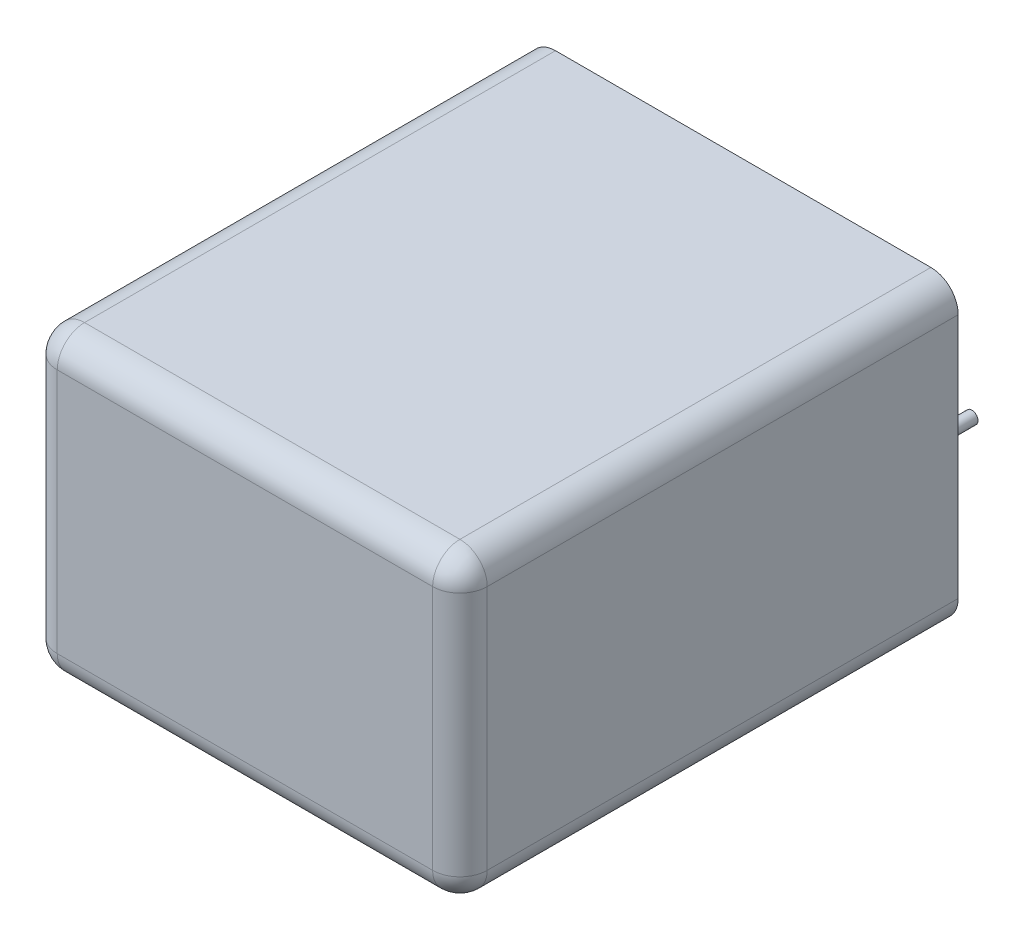
ISO-10303-21;
HEADER;
FILE_DESCRIPTION(('STEP AP214'),'2;1');
FILE_NAME('part.step','',(''),(''),'','','');
FILE_SCHEMA(('AUTOMOTIVE_DESIGN { 1 0 10303 214 1 1 1 1 }'));
ENDSEC;
DATA;
#1=APPLICATION_CONTEXT('core data for automotive mechanical design processes');
#2=APPLICATION_PROTOCOL_DEFINITION('international standard','automotive_design',2000,#1);
#3=PRODUCT_CONTEXT('',#1,'mechanical');
#4=PRODUCT('Part','Part','',(#3));
#5=PRODUCT_RELATED_PRODUCT_CATEGORY('part','',(#4));
#6=PRODUCT_DEFINITION_FORMATION('','',#4);
#7=PRODUCT_DEFINITION_CONTEXT('part definition',#1,'design');
#8=PRODUCT_DEFINITION('design','',#6,#7);
#9=PRODUCT_DEFINITION_SHAPE('','',#8);
#10=(LENGTH_UNIT() NAMED_UNIT(*) SI_UNIT(.MILLI.,.METRE.));
#11=(NAMED_UNIT(*) PLANE_ANGLE_UNIT() SI_UNIT($,.RADIAN.));
#12=(NAMED_UNIT(*) SI_UNIT($,.STERADIAN.) SOLID_ANGLE_UNIT());
#13=UNCERTAINTY_MEASURE_WITH_UNIT(LENGTH_MEASURE(1.E-05),#10,'distance_accuracy_value','');
#14=(GEOMETRIC_REPRESENTATION_CONTEXT(3) GLOBAL_UNCERTAINTY_ASSIGNED_CONTEXT((#13)) GLOBAL_UNIT_ASSIGNED_CONTEXT((#10,
#11,#12)) REPRESENTATION_CONTEXT('',''));
#15=CARTESIAN_POINT('',(0.,0.,0.));
#16=DIRECTION('',(0.,0.,1.));
#17=DIRECTION('',(1.,0.,0.));
#18=AXIS2_PLACEMENT_3D('',#15,#16,#17);
#19=CARTESIAN_POINT('',(0.,0.,-3.));
#20=DIRECTION('',(0.,0.,-1.));
#21=DIRECTION('',(-1.,0.,0.));
#22=AXIS2_PLACEMENT_3D('',#19,#20,#21);
#23=PLANE('',#22);
#24=CARTESIAN_POINT('',(0.,0.,-3.));
#25=DIRECTION('',(0.,0.,1.));
#26=DIRECTION('',(1.,0.,0.));
#27=AXIS2_PLACEMENT_3D('',#24,#25,#26);
#28=CIRCLE('',#27,0.45);
#29=CARTESIAN_POINT('',(0.45,0.,-3.));
#30=VERTEX_POINT('',#29);
#31=EDGE_CURVE('E20',#30,#30,#28,.T.);
#32=ORIENTED_EDGE('',*,*,#31,.F.);
#33=EDGE_LOOP('',(#32));
#34=FACE_BOUND('',#33,.T.);
#35=ADVANCED_FACE('F17',(#34),#23,.T.);
#36=CARTESIAN_POINT('',(27.5,0.,-3.));
#37=DIRECTION('',(0.,0.,-1.));
#38=DIRECTION('',(-1.,0.,0.));
#39=AXIS2_PLACEMENT_3D('',#36,#37,#38);
#40=PLANE('',#39);
#41=CARTESIAN_POINT('',(27.5,0.,-3.));
#42=DIRECTION('',(0.,0.,1.));
#43=DIRECTION('',(1.,0.,0.));
#44=AXIS2_PLACEMENT_3D('',#41,#42,#43);
#45=CIRCLE('',#44,0.45);
#46=CARTESIAN_POINT('',(27.95,0.,-3.));
#47=VERTEX_POINT('',#46);
#48=EDGE_CURVE('E246',#47,#47,#45,.T.);
#49=ORIENTED_EDGE('',*,*,#48,.F.);
#50=EDGE_LOOP('',(#49));
#51=FACE_BOUND('',#50,.T.);
#52=ADVANCED_FACE('F482',(#51),#40,.T.);
#53=CARTESIAN_POINT('',(0.,9.,34.5));
#54=DIRECTION('',(1.,0.,0.));
#55=DIRECTION('',(0.,0.,-1.));
#56=AXIS2_PLACEMENT_3D('',#53,#54,#55);
#57=SPHERICAL_SURFACE('',#56,2.);
#58=CARTESIAN_POINT('',(0.,9.,34.5));
#59=DIRECTION('',(1.,0.,0.));
#60=DIRECTION('',(0.,0.,-1.));
#61=AXIS2_PLACEMENT_3D('',#58,#59,#60);
#62=CIRCLE('',#61,2.);
#63=CARTESIAN_POINT('',(0.,11.,34.5));
#64=VERTEX_POINT('',#63);
#65=CARTESIAN_POINT('',(0.,8.99999999999693,36.5));
#66=VERTEX_POINT('',#65);
#67=EDGE_CURVE('E225',#64,#66,#62,.T.);
#68=ORIENTED_EDGE('',*,*,#67,.F.);
#69=CARTESIAN_POINT('',(0.,9.,34.5));
#70=DIRECTION('',(0.,0.,1.));
#71=DIRECTION('',(1.,0.,0.));
#72=AXIS2_PLACEMENT_3D('',#69,#70,#71);
#73=CIRCLE('',#72,2.);
#74=CARTESIAN_POINT('',(-2.,9.,34.5));
#75=VERTEX_POINT('',#74);
#76=EDGE_CURVE('E112',#75,#64,#73,.F.);
#77=ORIENTED_EDGE('',*,*,#76,.F.);
#78=CARTESIAN_POINT('',(0.,9.,34.5));
#79=DIRECTION('',(0.,1.,0.));
#80=DIRECTION('',(0.,0.,1.));
#81=AXIS2_PLACEMENT_3D('',#78,#79,#80);
#82=CIRCLE('',#81,2.);
#83=EDGE_CURVE('E227',#66,#75,#82,.F.);
#84=ORIENTED_EDGE('',*,*,#83,.F.);
#85=EDGE_LOOP('',(#68,#77,#84));
#86=FACE_BOUND('',#85,.T.);
#87=ADVANCED_FACE('F214',(#86),#57,.T.);
#88=CARTESIAN_POINT('',(27.5,9.,34.5));
#89=DIRECTION('',(1.,0.,0.));
#90=DIRECTION('',(0.,0.,-1.));
#91=AXIS2_PLACEMENT_3D('',#88,#89,#90);
#92=SPHERICAL_SURFACE('',#91,2.);
#93=CARTESIAN_POINT('',(27.5,9.,34.5));
#94=DIRECTION('',(0.,0.,-1.));
#95=DIRECTION('',(-1.,0.,0.));
#96=AXIS2_PLACEMENT_3D('',#93,#94,#95);
#97=CIRCLE('',#96,2.);
#98=CARTESIAN_POINT('',(27.5,11.,34.5));
#99=VERTEX_POINT('',#98);
#100=CARTESIAN_POINT('',(29.5,9.,34.5));
#101=VERTEX_POINT('',#100);
#102=EDGE_CURVE('E270',#99,#101,#97,.T.);
#103=ORIENTED_EDGE('',*,*,#102,.F.);
#104=CARTESIAN_POINT('',(27.5,9.,34.5));
#105=DIRECTION('',(1.,0.,0.));
#106=DIRECTION('',(0.,0.,-1.));
#107=AXIS2_PLACEMENT_3D('',#104,#105,#106);
#108=CIRCLE('',#107,2.);
#109=CARTESIAN_POINT('',(27.5,9.,36.5));
#110=VERTEX_POINT('',#109);
#111=EDGE_CURVE('E228',#110,#99,#108,.F.);
#112=ORIENTED_EDGE('',*,*,#111,.F.);
#113=CARTESIAN_POINT('',(27.5,9.,34.5));
#114=DIRECTION('',(0.,1.,0.));
#115=DIRECTION('',(0.,0.,1.));
#116=AXIS2_PLACEMENT_3D('',#113,#114,#115);
#117=CIRCLE('',#116,2.);
#118=EDGE_CURVE('E293',#101,#110,#117,.F.);
#119=ORIENTED_EDGE('',*,*,#118,.F.);
#120=EDGE_LOOP('',(#103,#112,#119));
#121=FACE_BOUND('',#120,.T.);
#122=ADVANCED_FACE('F209',(#121),#92,.T.);
#123=CARTESIAN_POINT('',(27.5,-11.,34.5));
#124=DIRECTION('',(0.,1.,0.));
#125=DIRECTION('',(0.,0.,1.));
#126=AXIS2_PLACEMENT_3D('',#123,#124,#125);
#127=CYLINDRICAL_SURFACE('',#126,2.);
#128=ORIENTED_EDGE('',*,*,#118,.T.);
#129=DIRECTION('',(0.,1.,0.));
#130=VECTOR('',#129,1.);
#131=CARTESIAN_POINT('',(27.5,-11.,36.5));
#132=LINE('',#131,#130);
#133=CARTESIAN_POINT('',(27.5,-8.99999999998773,36.5));
#134=VERTEX_POINT('',#133);
#135=EDGE_CURVE('E302',#134,#110,#132,.T.);
#136=ORIENTED_EDGE('',*,*,#135,.F.);
#137=CARTESIAN_POINT('',(27.5,-9.,34.5));
#138=DIRECTION('',(0.,-1.,2.45324985952171E-11));
#139=DIRECTION('',(1.,0.,0.));
#140=AXIS2_PLACEMENT_3D('',#137,#138,#139);
#141=CIRCLE('',#140,2.);
#142=CARTESIAN_POINT('',(29.5,-9.,34.5));
#143=VERTEX_POINT('',#142);
#144=EDGE_CURVE('E286',#143,#134,#141,.T.);
#145=ORIENTED_EDGE('',*,*,#144,.F.);
#146=DIRECTION('',(0.,1.,0.));
#147=VECTOR('',#146,1.);
#148=CARTESIAN_POINT('',(29.5,-11.,34.5));
#149=LINE('',#148,#147);
#150=EDGE_CURVE('E275',#101,#143,#149,.F.);
#151=ORIENTED_EDGE('',*,*,#150,.F.);
#152=EDGE_LOOP('',(#128,#136,#145,#151));
#153=FACE_BOUND('',#152,.T.);
#154=ADVANCED_FACE('F205',(#153),#127,.T.);
#155=CARTESIAN_POINT('',(0.,9.,34.5));
#156=DIRECTION('',(1.,0.,0.));
#157=DIRECTION('',(0.,0.,-1.));
#158=AXIS2_PLACEMENT_3D('',#155,#156,#157);
#159=CYLINDRICAL_SURFACE('',#158,2.);
#160=ORIENTED_EDGE('',*,*,#67,.T.);
#161=DIRECTION('',(1.,0.,0.));
#162=VECTOR('',#161,1.);
#163=CARTESIAN_POINT('',(-2.,9.,36.5));
#164=LINE('',#163,#162);
#165=EDGE_CURVE('E234',#110,#66,#164,.F.);
#166=ORIENTED_EDGE('',*,*,#165,.F.);
#167=ORIENTED_EDGE('',*,*,#111,.T.);
#168=DIRECTION('',(1.,0.,0.));
#169=VECTOR('',#168,1.);
#170=CARTESIAN_POINT('',(0.,11.,34.5));
#171=LINE('',#170,#169);
#172=EDGE_CURVE('E116',#64,#99,#171,.T.);
#173=ORIENTED_EDGE('',*,*,#172,.F.);
#174=EDGE_LOOP('',(#160,#166,#167,#173));
#175=FACE_BOUND('',#174,.T.);
#176=ADVANCED_FACE('F201',(#175),#159,.T.);
#177=CARTESIAN_POINT('',(0.,-11.,34.5));
#178=DIRECTION('',(0.,1.,0.));
#179=DIRECTION('',(0.,0.,1.));
#180=AXIS2_PLACEMENT_3D('',#177,#178,#179);
#181=CYLINDRICAL_SURFACE('',#180,2.);
#182=ORIENTED_EDGE('',*,*,#83,.T.);
#183=DIRECTION('',(0.,1.,0.));
#184=VECTOR('',#183,1.);
#185=CARTESIAN_POINT('',(-2.,-11.,34.5));
#186=LINE('',#185,#184);
#187=CARTESIAN_POINT('',(-2.,-9.,34.5));
#188=VERTEX_POINT('',#187);
#189=EDGE_CURVE('E287',#188,#75,#186,.T.);
#190=ORIENTED_EDGE('',*,*,#189,.F.);
#191=CARTESIAN_POINT('',(0.,-9.,34.5));
#192=DIRECTION('',(0.,-1.,0.));
#193=DIRECTION('',(1.,0.,0.));
#194=AXIS2_PLACEMENT_3D('',#191,#192,#193);
#195=CIRCLE('',#194,2.);
#196=CARTESIAN_POINT('',(0.,-9.,36.5));
#197=VERTEX_POINT('',#196);
#198=EDGE_CURVE('E143',#197,#188,#195,.T.);
#199=ORIENTED_EDGE('',*,*,#198,.F.);
#200=DIRECTION('',(0.,1.,0.));
#201=VECTOR('',#200,1.);
#202=CARTESIAN_POINT('',(0.,-11.,36.5));
#203=LINE('',#202,#201);
#204=EDGE_CURVE('E232',#66,#197,#203,.F.);
#205=ORIENTED_EDGE('',*,*,#204,.F.);
#206=EDGE_LOOP('',(#182,#190,#199,#205));
#207=FACE_BOUND('',#206,.T.);
#208=ADVANCED_FACE('F197',(#207),#181,.T.);
#209=CARTESIAN_POINT('',(0.,0.,-3.));
#210=DIRECTION('',(0.,0.,1.));
#211=DIRECTION('',(1.,0.,0.));
#212=AXIS2_PLACEMENT_3D('',#209,#210,#211);
#213=CYLINDRICAL_SURFACE('',#212,0.45);
#214=CARTESIAN_POINT('',(0.,0.,0.));
#215=DIRECTION('',(0.,0.,1.));
#216=DIRECTION('',(1.,0.,0.));
#217=AXIS2_PLACEMENT_3D('',#214,#215,#216);
#218=CIRCLE('',#217,0.45);
#219=CARTESIAN_POINT('',(0.45,0.,0.));
#220=VERTEX_POINT('',#219);
#221=EDGE_CURVE('E244',#220,#220,#218,.T.);
#222=ORIENTED_EDGE('',*,*,#221,.F.);
#223=EDGE_LOOP('',(#222));
#224=FACE_BOUND('',#223,.T.);
#225=ORIENTED_EDGE('',*,*,#31,.T.);
#226=EDGE_LOOP('',(#225));
#227=FACE_BOUND('',#226,.T.);
#228=ADVANCED_FACE('F193',(#224,#227),#213,.T.);
#229=CARTESIAN_POINT('',(27.5,0.,-3.));
#230=DIRECTION('',(0.,0.,1.));
#231=DIRECTION('',(1.,0.,0.));
#232=AXIS2_PLACEMENT_3D('',#229,#230,#231);
#233=CYLINDRICAL_SURFACE('',#232,0.45);
#234=CARTESIAN_POINT('',(27.5,0.,0.));
#235=DIRECTION('',(0.,0.,1.));
#236=DIRECTION('',(1.,0.,0.));
#237=AXIS2_PLACEMENT_3D('',#234,#235,#236);
#238=CIRCLE('',#237,0.45);
#239=CARTESIAN_POINT('',(27.95,0.,0.));
#240=VERTEX_POINT('',#239);
#241=EDGE_CURVE('E130',#240,#240,#238,.T.);
#242=ORIENTED_EDGE('',*,*,#241,.F.);
#243=EDGE_LOOP('',(#242));
#244=FACE_BOUND('',#243,.T.);
#245=ORIENTED_EDGE('',*,*,#48,.T.);
#246=EDGE_LOOP('',(#245));
#247=FACE_BOUND('',#246,.T.);
#248=ADVANCED_FACE('F190',(#244,#247),#233,.T.);
#249=CARTESIAN_POINT('',(0.,9.,0.));
#250=DIRECTION('',(0.,0.,1.));
#251=DIRECTION('',(1.,0.,0.));
#252=AXIS2_PLACEMENT_3D('',#249,#250,#251);
#253=CYLINDRICAL_SURFACE('',#252,2.);
#254=ORIENTED_EDGE('',*,*,#76,.T.);
#255=DIRECTION('',(0.,0.,1.));
#256=VECTOR('',#255,1.);
#257=CARTESIAN_POINT('',(0.,11.,0.));
#258=LINE('',#257,#256);
#259=CARTESIAN_POINT('',(0.,11.,0.));
#260=VERTEX_POINT('',#259);
#261=EDGE_CURVE('E109',#260,#64,#258,.T.);
#262=ORIENTED_EDGE('',*,*,#261,.F.);
#263=CARTESIAN_POINT('',(0.,9.,0.));
#264=DIRECTION('',(0.,0.,1.));
#265=DIRECTION('',(1.,0.,0.));
#266=AXIS2_PLACEMENT_3D('',#263,#264,#265);
#267=CIRCLE('',#266,2.);
#268=CARTESIAN_POINT('',(-2.,9.,0.));
#269=VERTEX_POINT('',#268);
#270=EDGE_CURVE('E96',#269,#260,#267,.F.);
#271=ORIENTED_EDGE('',*,*,#270,.F.);
#272=DIRECTION('',(0.,0.,1.));
#273=VECTOR('',#272,1.);
#274=CARTESIAN_POINT('',(-2.,9.,0.));
#275=LINE('',#274,#273);
#276=EDGE_CURVE('E91',#75,#269,#275,.F.);
#277=ORIENTED_EDGE('',*,*,#276,.F.);
#278=EDGE_LOOP('',(#254,#262,#271,#277));
#279=FACE_BOUND('',#278,.T.);
#280=ADVANCED_FACE('F110',(#279),#253,.T.);
#281=CARTESIAN_POINT('',(0.,11.,0.));
#282=DIRECTION('',(0.,1.,0.));
#283=DIRECTION('',(0.,0.,1.));
#284=AXIS2_PLACEMENT_3D('',#281,#282,#283);
#285=PLANE('',#284);
#286=ORIENTED_EDGE('',*,*,#172,.T.);
#287=DIRECTION('',(0.,0.,-1.));
#288=VECTOR('',#287,1.);
#289=CARTESIAN_POINT('',(27.5,11.,0.));
#290=LINE('',#289,#288);
#291=CARTESIAN_POINT('',(27.5,11.,0.));
#292=VERTEX_POINT('',#291);
#293=EDGE_CURVE('E120',#292,#99,#290,.F.);
#294=ORIENTED_EDGE('',*,*,#293,.F.);
#295=DIRECTION('',(-1.,0.,0.));
#296=VECTOR('',#295,1.);
#297=CARTESIAN_POINT('',(29.5,11.,0.));
#298=LINE('',#297,#296);
#299=EDGE_CURVE('E102',#260,#292,#298,.F.);
#300=ORIENTED_EDGE('',*,*,#299,.F.);
#301=ORIENTED_EDGE('',*,*,#261,.T.);
#302=EDGE_LOOP('',(#286,#294,#300,#301));
#303=FACE_BOUND('',#302,.T.);
#304=ADVANCED_FACE('F118',(#303),#285,.T.);
#305=CARTESIAN_POINT('',(27.5,9.,0.));
#306=DIRECTION('',(0.,0.,-1.));
#307=DIRECTION('',(-1.,0.,0.));
#308=AXIS2_PLACEMENT_3D('',#305,#306,#307);
#309=CYLINDRICAL_SURFACE('',#308,2.);
#310=ORIENTED_EDGE('',*,*,#102,.T.);
#311=DIRECTION('',(0.,0.,-1.));
#312=VECTOR('',#311,1.);
#313=CARTESIAN_POINT('',(29.5,9.,36.5));
#314=LINE('',#313,#312);
#315=CARTESIAN_POINT('',(29.5,9.,0.));
#316=VERTEX_POINT('',#315);
#317=EDGE_CURVE('E271',#316,#101,#314,.F.);
#318=ORIENTED_EDGE('',*,*,#317,.F.);
#319=CARTESIAN_POINT('',(27.5,9.,0.));
#320=DIRECTION('',(0.,0.,-1.));
#321=DIRECTION('',(-1.,0.,0.));
#322=AXIS2_PLACEMENT_3D('',#319,#320,#321);
#323=CIRCLE('',#322,2.);
#324=EDGE_CURVE('E122',#292,#316,#323,.T.);
#325=ORIENTED_EDGE('',*,*,#324,.F.);
#326=ORIENTED_EDGE('',*,*,#293,.T.);
#327=EDGE_LOOP('',(#310,#318,#325,#326));
#328=FACE_BOUND('',#327,.T.);
#329=ADVANCED_FACE('F181',(#328),#309,.T.);
#330=CARTESIAN_POINT('',(29.5,-11.,36.5));
#331=DIRECTION('',(1.,0.,0.));
#332=DIRECTION('',(0.,0.,-1.));
#333=AXIS2_PLACEMENT_3D('',#330,#331,#332);
#334=PLANE('',#333);
#335=ORIENTED_EDGE('',*,*,#150,.T.);
#336=DIRECTION('',(0.,0.,1.));
#337=VECTOR('',#336,1.);
#338=CARTESIAN_POINT('',(29.5,-9.,36.5));
#339=LINE('',#338,#337);
#340=CARTESIAN_POINT('',(29.5,-9.,0.));
#341=VERTEX_POINT('',#340);
#342=EDGE_CURVE('E142',#341,#143,#339,.T.);
#343=ORIENTED_EDGE('',*,*,#342,.F.);
#344=DIRECTION('',(0.,1.,0.));
#345=VECTOR('',#344,1.);
#346=CARTESIAN_POINT('',(29.5,-11.,0.));
#347=LINE('',#346,#345);
#348=EDGE_CURVE('E124',#316,#341,#347,.F.);
#349=ORIENTED_EDGE('',*,*,#348,.F.);
#350=ORIENTED_EDGE('',*,*,#317,.T.);
#351=EDGE_LOOP('',(#335,#343,#349,#350));
#352=FACE_BOUND('',#351,.T.);
#353=ADVANCED_FACE('F178',(#352),#334,.T.);
#354=CARTESIAN_POINT('',(-2.,-11.,0.));
#355=DIRECTION('',(-1.,0.,0.));
#356=DIRECTION('',(0.,0.,1.));
#357=AXIS2_PLACEMENT_3D('',#354,#355,#356);
#358=PLANE('',#357);
#359=DIRECTION('',(0.,1.,0.));
#360=VECTOR('',#359,1.);
#361=CARTESIAN_POINT('',(-2.,-11.,0.));
#362=LINE('',#361,#360);
#363=CARTESIAN_POINT('',(-2.,-9.,0.));
#364=VERTEX_POINT('',#363);
#365=EDGE_CURVE('E105',#364,#269,#362,.T.);
#366=ORIENTED_EDGE('',*,*,#365,.F.);
#367=DIRECTION('',(0.,0.,-1.));
#368=VECTOR('',#367,1.);
#369=CARTESIAN_POINT('',(-2.,-9.,0.));
#370=LINE('',#369,#368);
#371=EDGE_CURVE('E150',#188,#364,#370,.T.);
#372=ORIENTED_EDGE('',*,*,#371,.F.);
#373=ORIENTED_EDGE('',*,*,#189,.T.);
#374=ORIENTED_EDGE('',*,*,#276,.T.);
#375=EDGE_LOOP('',(#366,#372,#373,#374));
#376=FACE_BOUND('',#375,.T.);
#377=ADVANCED_FACE('F174',(#376),#358,.T.);
#378=CARTESIAN_POINT('',(27.5,-9.,34.5));
#379=DIRECTION('',(1.,0.,0.));
#380=DIRECTION('',(0.,0.,-1.));
#381=AXIS2_PLACEMENT_3D('',#378,#379,#380);
#382=SPHERICAL_SURFACE('',#381,2.);
#383=CARTESIAN_POINT('',(27.5,-9.,34.5));
#384=DIRECTION('',(0.,0.,1.));
#385=DIRECTION('',(1.,0.,0.));
#386=AXIS2_PLACEMENT_3D('',#383,#384,#385);
#387=CIRCLE('',#386,2.);
#388=CARTESIAN_POINT('',(27.5,-11.,34.5));
#389=VERTEX_POINT('',#388);
#390=EDGE_CURVE('E140',#143,#389,#387,.F.);
#391=ORIENTED_EDGE('',*,*,#390,.F.);
#392=ORIENTED_EDGE('',*,*,#144,.T.);
#393=CARTESIAN_POINT('',(27.5,-9.,34.5));
#394=DIRECTION('',(-1.,0.,0.));
#395=DIRECTION('',(0.,0.,1.));
#396=AXIS2_PLACEMENT_3D('',#393,#394,#395);
#397=CIRCLE('',#396,2.);
#398=EDGE_CURVE('E146',#389,#134,#397,.T.);
#399=ORIENTED_EDGE('',*,*,#398,.F.);
#400=EDGE_LOOP('',(#391,#392,#399));
#401=FACE_BOUND('',#400,.T.);
#402=ADVANCED_FACE('F170',(#401),#382,.T.);
#403=CARTESIAN_POINT('',(-2.,-11.,36.5));
#404=DIRECTION('',(0.,0.,1.));
#405=DIRECTION('',(1.,0.,0.));
#406=AXIS2_PLACEMENT_3D('',#403,#404,#405);
#407=PLANE('',#406);
#408=ORIENTED_EDGE('',*,*,#204,.T.);
#409=DIRECTION('',(-1.,0.,0.));
#410=VECTOR('',#409,1.);
#411=CARTESIAN_POINT('',(-2.,-9.,36.5));
#412=LINE('',#411,#410);
#413=EDGE_CURVE('E149',#134,#197,#412,.T.);
#414=ORIENTED_EDGE('',*,*,#413,.F.);
#415=ORIENTED_EDGE('',*,*,#135,.T.);
#416=ORIENTED_EDGE('',*,*,#165,.T.);
#417=EDGE_LOOP('',(#408,#414,#415,#416));
#418=FACE_BOUND('',#417,.T.);
#419=ADVANCED_FACE('F165',(#418),#407,.T.);
#420=CARTESIAN_POINT('',(0.,-9.,34.5));
#421=DIRECTION('',(1.,0.,0.));
#422=DIRECTION('',(0.,0.,-1.));
#423=AXIS2_PLACEMENT_3D('',#420,#421,#422);
#424=SPHERICAL_SURFACE('',#423,2.);
#425=CARTESIAN_POINT('',(0.,-9.,34.5));
#426=DIRECTION('',(-1.,0.,0.));
#427=DIRECTION('',(0.,0.,1.));
#428=AXIS2_PLACEMENT_3D('',#425,#426,#427);
#429=CIRCLE('',#428,2.);
#430=CARTESIAN_POINT('',(0.,-11.,34.5));
#431=VERTEX_POINT('',#430);
#432=EDGE_CURVE('E34',#197,#431,#429,.F.);
#433=ORIENTED_EDGE('',*,*,#432,.F.);
#434=ORIENTED_EDGE('',*,*,#198,.T.);
#435=CARTESIAN_POINT('',(0.,-9.,34.5));
#436=DIRECTION('',(0.,0.,-1.));
#437=DIRECTION('',(-1.,0.,0.));
#438=AXIS2_PLACEMENT_3D('',#435,#436,#437);
#439=CIRCLE('',#438,2.);
#440=EDGE_CURVE('E239',#431,#188,#439,.T.);
#441=ORIENTED_EDGE('',*,*,#440,.F.);
#442=EDGE_LOOP('',(#433,#434,#441));
#443=FACE_BOUND('',#442,.T.);
#444=ADVANCED_FACE('F160',(#443),#424,.T.);
#445=CARTESIAN_POINT('',(27.5,-9.,36.5));
#446=DIRECTION('',(0.,0.,1.));
#447=DIRECTION('',(1.,0.,0.));
#448=AXIS2_PLACEMENT_3D('',#445,#446,#447);
#449=CYLINDRICAL_SURFACE('',#448,2.);
#450=CARTESIAN_POINT('',(27.5,-9.,0.));
#451=DIRECTION('',(0.,0.,1.));
#452=DIRECTION('',(1.,0.,0.));
#453=AXIS2_PLACEMENT_3D('',#450,#451,#452);
#454=CIRCLE('',#453,2.);
#455=CARTESIAN_POINT('',(27.5,-11.,0.));
#456=VERTEX_POINT('',#455);
#457=EDGE_CURVE('E240',#341,#456,#454,.F.);
#458=ORIENTED_EDGE('',*,*,#457,.F.);
#459=ORIENTED_EDGE('',*,*,#342,.T.);
#460=ORIENTED_EDGE('',*,*,#390,.T.);
#461=DIRECTION('',(0.,0.,1.));
#462=VECTOR('',#461,1.);
#463=CARTESIAN_POINT('',(27.5,-11.,0.));
#464=LINE('',#463,#462);
#465=EDGE_CURVE('E131',#389,#456,#464,.F.);
#466=ORIENTED_EDGE('',*,*,#465,.T.);
#467=EDGE_LOOP('',(#458,#459,#460,#466));
#468=FACE_BOUND('',#467,.T.);
#469=ADVANCED_FACE('F164',(#468),#449,.T.);
#470=CARTESIAN_POINT('',(29.5,-11.,0.));
#471=DIRECTION('',(0.,0.,-1.));
#472=DIRECTION('',(-1.,0.,0.));
#473=AXIS2_PLACEMENT_3D('',#470,#471,#472);
#474=PLANE('',#473);
#475=DIRECTION('',(1.,0.,0.));
#476=VECTOR('',#475,1.);
#477=CARTESIAN_POINT('',(0.,-11.,0.));
#478=LINE('',#477,#476);
#479=CARTESIAN_POINT('',(0.,-11.,0.));
#480=VERTEX_POINT('',#479);
#481=EDGE_CURVE('E134',#456,#480,#478,.F.);
#482=ORIENTED_EDGE('',*,*,#481,.T.);
#483=CARTESIAN_POINT('',(0.,-9.,0.));
#484=DIRECTION('',(0.,0.,-1.));
#485=DIRECTION('',(-1.,0.,0.));
#486=AXIS2_PLACEMENT_3D('',#483,#484,#485);
#487=CIRCLE('',#486,2.);
#488=EDGE_CURVE('E237',#364,#480,#487,.F.);
#489=ORIENTED_EDGE('',*,*,#488,.F.);
#490=ORIENTED_EDGE('',*,*,#365,.T.);
#491=ORIENTED_EDGE('',*,*,#270,.T.);
#492=ORIENTED_EDGE('',*,*,#299,.T.);
#493=ORIENTED_EDGE('',*,*,#324,.T.);
#494=ORIENTED_EDGE('',*,*,#348,.T.);
#495=ORIENTED_EDGE('',*,*,#457,.T.);
#496=EDGE_LOOP('',(#482,#489,#490,#491,#492,#493,#494,#495));
#497=FACE_BOUND('',#496,.T.);
#498=ORIENTED_EDGE('',*,*,#241,.T.);
#499=EDGE_LOOP('',(#498));
#500=FACE_BOUND('',#499,.T.);
#501=ORIENTED_EDGE('',*,*,#221,.T.);
#502=EDGE_LOOP('',(#501));
#503=FACE_BOUND('',#502,.T.);
#504=ADVANCED_FACE('F99',(#497,#500,#503),#474,.T.);
#505=CARTESIAN_POINT('',(0.,-9.,0.));
#506=DIRECTION('',(0.,0.,-1.));
#507=DIRECTION('',(-1.,0.,0.));
#508=AXIS2_PLACEMENT_3D('',#505,#506,#507);
#509=CYLINDRICAL_SURFACE('',#508,2.);
#510=ORIENTED_EDGE('',*,*,#440,.T.);
#511=ORIENTED_EDGE('',*,*,#371,.T.);
#512=ORIENTED_EDGE('',*,*,#488,.T.);
#513=DIRECTION('',(0.,0.,1.));
#514=VECTOR('',#513,1.);
#515=CARTESIAN_POINT('',(0.,-11.,0.));
#516=LINE('',#515,#514);
#517=EDGE_CURVE('E26',#480,#431,#516,.T.);
#518=ORIENTED_EDGE('',*,*,#517,.T.);
#519=EDGE_LOOP('',(#510,#511,#512,#518));
#520=FACE_BOUND('',#519,.T.);
#521=ADVANCED_FACE('F333',(#520),#509,.T.);
#522=CARTESIAN_POINT('',(-2.,-9.,34.5));
#523=DIRECTION('',(-1.,0.,0.));
#524=DIRECTION('',(0.,0.,1.));
#525=AXIS2_PLACEMENT_3D('',#522,#523,#524);
#526=CYLINDRICAL_SURFACE('',#525,2.);
#527=ORIENTED_EDGE('',*,*,#432,.T.);
#528=DIRECTION('',(1.,0.,0.));
#529=VECTOR('',#528,1.);
#530=CARTESIAN_POINT('',(0.,-11.,34.5));
#531=LINE('',#530,#529);
#532=EDGE_CURVE('E11',#431,#389,#531,.T.);
#533=ORIENTED_EDGE('',*,*,#532,.T.);
#534=ORIENTED_EDGE('',*,*,#398,.T.);
#535=ORIENTED_EDGE('',*,*,#413,.T.);
#536=EDGE_LOOP('',(#527,#533,#534,#535));
#537=FACE_BOUND('',#536,.T.);
#538=ADVANCED_FACE('F331',(#537),#526,.T.);
#539=CARTESIAN_POINT('',(0.,-11.,0.));
#540=DIRECTION('',(0.,1.,0.));
#541=DIRECTION('',(0.,0.,1.));
#542=AXIS2_PLACEMENT_3D('',#539,#540,#541);
#543=PLANE('',#542);
#544=ORIENTED_EDGE('',*,*,#517,.F.);
#545=ORIENTED_EDGE('',*,*,#481,.F.);
#546=ORIENTED_EDGE('',*,*,#465,.F.);
#547=ORIENTED_EDGE('',*,*,#532,.F.);
#548=EDGE_LOOP('',(#544,#545,#546,#547));
#549=FACE_BOUND('',#548,.T.);
#550=ADVANCED_FACE('F327',(#549),#543,.F.);
#551=CLOSED_SHELL('',(#35,#52,#87,#122,#154,#176,#208,#228,#248,#280,#304,#329,#353,#377,#402,
#419,#444,#469,#504,#521,#538,#550));
#552=MANIFOLD_SOLID_BREP('B1',#551);
#553=ADVANCED_BREP_SHAPE_REPRESENTATION('',(#18,#552),#14);
#554=SHAPE_DEFINITION_REPRESENTATION(#9,#553);
ENDSEC;
END-ISO-10303-21;
